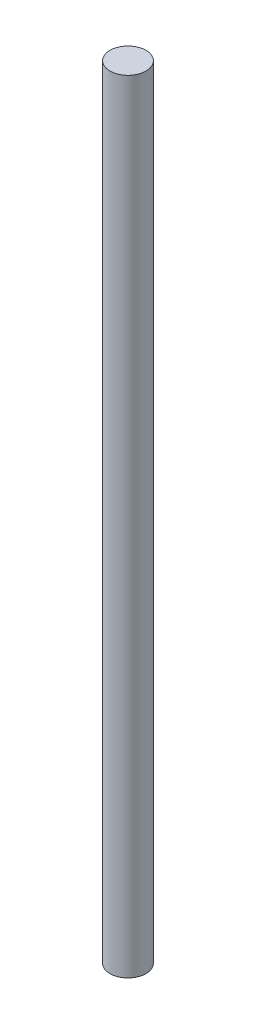
ISO-10303-21;
HEADER;
FILE_DESCRIPTION(('STEP AP214'),'2;1');
FILE_NAME('part.step','',(''),(''),'','','');
FILE_SCHEMA(('AUTOMOTIVE_DESIGN { 1 0 10303 214 1 1 1 1 }'));
ENDSEC;
DATA;
#1=APPLICATION_CONTEXT('core data for automotive mechanical design processes');
#2=APPLICATION_PROTOCOL_DEFINITION('international standard','automotive_design',2000,#1);
#3=PRODUCT_CONTEXT('',#1,'mechanical');
#4=PRODUCT('Part','Part','',(#3));
#5=PRODUCT_RELATED_PRODUCT_CATEGORY('part','',(#4));
#6=PRODUCT_DEFINITION_FORMATION('','',#4);
#7=PRODUCT_DEFINITION_CONTEXT('part definition',#1,'design');
#8=PRODUCT_DEFINITION('design','',#6,#7);
#9=PRODUCT_DEFINITION_SHAPE('','',#8);
#10=(LENGTH_UNIT() NAMED_UNIT(*) SI_UNIT(.MILLI.,.METRE.));
#11=(NAMED_UNIT(*) PLANE_ANGLE_UNIT() SI_UNIT($,.RADIAN.));
#12=(NAMED_UNIT(*) SI_UNIT($,.STERADIAN.) SOLID_ANGLE_UNIT());
#13=UNCERTAINTY_MEASURE_WITH_UNIT(LENGTH_MEASURE(1.E-05),#10,'distance_accuracy_value','');
#14=(GEOMETRIC_REPRESENTATION_CONTEXT(3) GLOBAL_UNCERTAINTY_ASSIGNED_CONTEXT((#13)) GLOBAL_UNIT_ASSIGNED_CONTEXT((#10,
#11,#12)) REPRESENTATION_CONTEXT('',''));
#15=CARTESIAN_POINT('',(0.,0.,0.));
#16=DIRECTION('',(0.,0.,1.));
#17=DIRECTION('',(1.,0.,0.));
#18=AXIS2_PLACEMENT_3D('',#15,#16,#17);
#19=CARTESIAN_POINT('',(0.,69.15,0.));
#20=DIRECTION('',(0.,-1.,0.));
#21=DIRECTION('',(0.,0.,-1.));
#22=AXIS2_PLACEMENT_3D('',#19,#20,#21);
#23=CYLINDRICAL_SURFACE('',#22,1.59);
#24=CARTESIAN_POINT('',(0.,69.15,0.));
#25=DIRECTION('',(0.,1.,0.));
#26=DIRECTION('',(0.,0.,1.));
#27=AXIS2_PLACEMENT_3D('',#24,#25,#26);
#28=CIRCLE('',#27,1.59);
#29=CARTESIAN_POINT('',(0.,69.15,1.59));
#30=VERTEX_POINT('',#29);
#31=EDGE_CURVE('E10',#30,#30,#28,.T.);
#32=ORIENTED_EDGE('',*,*,#31,.F.);
#33=EDGE_LOOP('',(#32));
#34=FACE_BOUND('',#33,.T.);
#35=CARTESIAN_POINT('',(0.,0.,0.));
#36=DIRECTION('',(0.,1.,0.));
#37=DIRECTION('',(0.,0.,1.));
#38=AXIS2_PLACEMENT_3D('',#35,#36,#37);
#39=CIRCLE('',#38,1.59);
#40=CARTESIAN_POINT('',(0.,0.,1.59));
#41=VERTEX_POINT('',#40);
#42=EDGE_CURVE('E37',#41,#41,#39,.T.);
#43=ORIENTED_EDGE('',*,*,#42,.T.);
#44=EDGE_LOOP('',(#43));
#45=FACE_BOUND('',#44,.T.);
#46=ADVANCED_FACE('F34',(#34,#45),#23,.T.);
#47=CARTESIAN_POINT('',(0.,69.15,0.));
#48=DIRECTION('',(0.,1.,0.));
#49=DIRECTION('',(0.,0.,1.));
#50=AXIS2_PLACEMENT_3D('',#47,#48,#49);
#51=PLANE('',#50);
#52=ORIENTED_EDGE('',*,*,#31,.T.);
#53=EDGE_LOOP('',(#52));
#54=FACE_BOUND('',#53,.T.);
#55=ADVANCED_FACE('F49',(#54),#51,.T.);
#56=CARTESIAN_POINT('',(0.,0.,0.));
#57=DIRECTION('',(0.,1.,0.));
#58=DIRECTION('',(0.,0.,1.));
#59=AXIS2_PLACEMENT_3D('',#56,#57,#58);
#60=PLANE('',#59);
#61=ORIENTED_EDGE('',*,*,#42,.F.);
#62=EDGE_LOOP('',(#61));
#63=FACE_BOUND('',#62,.T.);
#64=ADVANCED_FACE('F47',(#63),#60,.F.);
#65=CLOSED_SHELL('',(#46,#55,#64));
#66=MANIFOLD_SOLID_BREP('B2',#65);
#67=ADVANCED_BREP_SHAPE_REPRESENTATION('',(#18,#66),#14);
#68=SHAPE_DEFINITION_REPRESENTATION(#9,#67);
ENDSEC;
END-ISO-10303-21;
